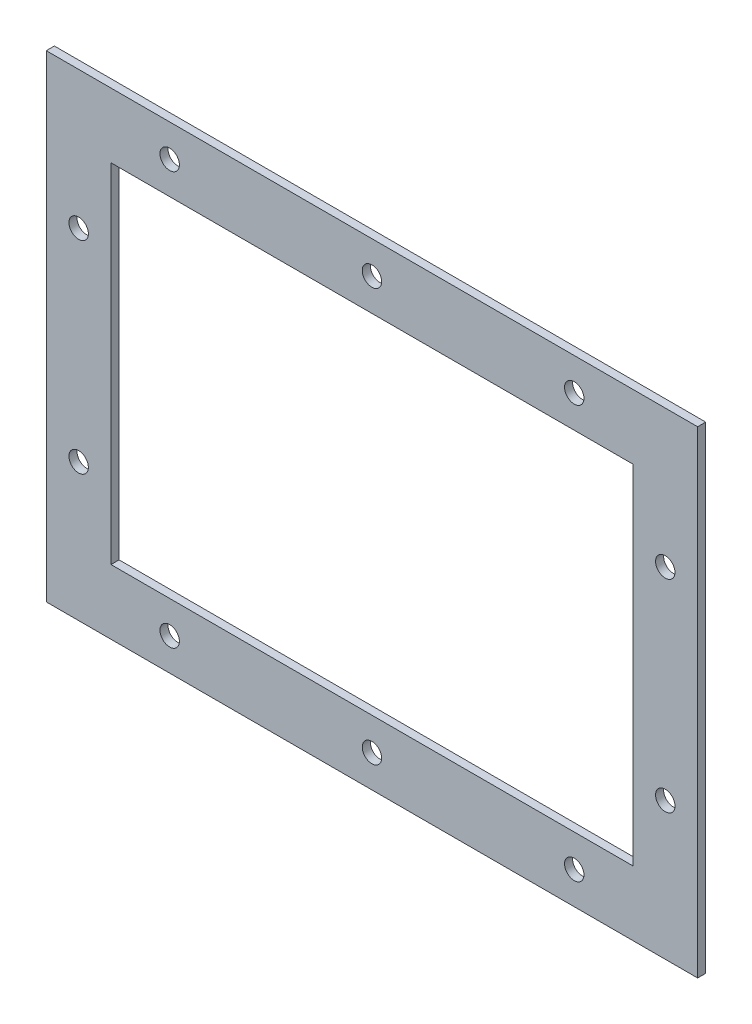
ISO-10303-21;
HEADER;
FILE_DESCRIPTION(('STEP AP214'),'2;1');
FILE_NAME('part.step','',(''),(''),'','','');
FILE_SCHEMA(('AUTOMOTIVE_DESIGN { 1 0 10303 214 1 1 1 1 }'));
ENDSEC;
DATA;
#1=APPLICATION_CONTEXT('core data for automotive mechanical design processes');
#2=APPLICATION_PROTOCOL_DEFINITION('international standard','automotive_design',2000,#1);
#3=PRODUCT_CONTEXT('',#1,'mechanical');
#4=PRODUCT('Part','Part','',(#3));
#5=PRODUCT_RELATED_PRODUCT_CATEGORY('part','',(#4));
#6=PRODUCT_DEFINITION_FORMATION('','',#4);
#7=PRODUCT_DEFINITION_CONTEXT('part definition',#1,'design');
#8=PRODUCT_DEFINITION('design','',#6,#7);
#9=PRODUCT_DEFINITION_SHAPE('','',#8);
#10=(LENGTH_UNIT() NAMED_UNIT(*) SI_UNIT(.MILLI.,.METRE.));
#11=(NAMED_UNIT(*) PLANE_ANGLE_UNIT() SI_UNIT($,.RADIAN.));
#12=(NAMED_UNIT(*) SI_UNIT($,.STERADIAN.) SOLID_ANGLE_UNIT());
#13=UNCERTAINTY_MEASURE_WITH_UNIT(LENGTH_MEASURE(1.E-05),#10,'distance_accuracy_value','');
#14=(GEOMETRIC_REPRESENTATION_CONTEXT(3) GLOBAL_UNCERTAINTY_ASSIGNED_CONTEXT((#13)) GLOBAL_UNIT_ASSIGNED_CONTEXT((#10,
#11,#12)) REPRESENTATION_CONTEXT('',''));
#15=CARTESIAN_POINT('',(0.,0.,0.));
#16=DIRECTION('',(0.,0.,1.));
#17=DIRECTION('',(1.,0.,0.));
#18=AXIS2_PLACEMENT_3D('',#15,#16,#17);
#19=CARTESIAN_POINT('',(0.,0.,5.));
#20=DIRECTION('',(0.,0.,1.));
#21=DIRECTION('',(1.,0.,0.));
#22=AXIS2_PLACEMENT_3D('',#19,#20,#21);
#23=PLANE('',#22);
#24=CARTESIAN_POINT('',(148.780112044818,-55.5000000000001,5.));
#25=DIRECTION('',(0.,0.,1.));
#26=DIRECTION('',(-1.,0.,0.));
#27=AXIS2_PLACEMENT_3D('',#24,#25,#26);
#28=CIRCLE('',#27,6.00000000000002);
#29=CARTESIAN_POINT('',(142.780112044818,-55.5000000000001,5.));
#30=VERTEX_POINT('',#29);
#31=EDGE_CURVE('E266',#30,#30,#28,.T.);
#32=ORIENTED_EDGE('',*,*,#31,.F.);
#33=EDGE_LOOP('',(#32));
#34=FACE_BOUND('',#33,.T.);
#35=CARTESIAN_POINT('',(-157.469887955182,134.5,5.));
#36=DIRECTION('',(0.,0.,1.));
#37=DIRECTION('',(1.,0.,0.));
#38=AXIS2_PLACEMENT_3D('',#35,#36,#37);
#39=CIRCLE('',#38,6.00000000000002);
#40=CARTESIAN_POINT('',(-151.469887955182,134.5,5.));
#41=VERTEX_POINT('',#40);
#42=EDGE_CURVE('E285',#41,#41,#39,.T.);
#43=ORIENTED_EDGE('',*,*,#42,.F.);
#44=EDGE_LOOP('',(#43));
#45=FACE_BOUND('',#44,.T.);
#46=CARTESIAN_POINT('',(92.5301120448178,-120.5,5.));
#47=DIRECTION('',(0.,0.,1.));
#48=DIRECTION('',(-1.,0.,0.));
#49=AXIS2_PLACEMENT_3D('',#46,#47,#48);
#50=CIRCLE('',#49,5.99999999999999);
#51=CARTESIAN_POINT('',(86.5301120448179,-120.5,5.));
#52=VERTEX_POINT('',#51);
#53=EDGE_CURVE('E279',#52,#52,#50,.T.);
#54=ORIENTED_EDGE('',*,*,#53,.F.);
#55=EDGE_LOOP('',(#54));
#56=FACE_BOUND('',#55,.T.);
#57=CARTESIAN_POINT('',(-32.4698879551822,-120.5,5.));
#58=DIRECTION('',(0.,0.,1.));
#59=DIRECTION('',(-1.,0.,0.));
#60=AXIS2_PLACEMENT_3D('',#57,#58,#59);
#61=CIRCLE('',#60,6.00000000000002);
#62=CARTESIAN_POINT('',(-38.4698879551822,-120.5,5.));
#63=VERTEX_POINT('',#62);
#64=EDGE_CURVE('E273',#63,#63,#61,.T.);
#65=ORIENTED_EDGE('',*,*,#64,.F.);
#66=EDGE_LOOP('',(#65));
#67=FACE_BOUND('',#66,.T.);
#68=CARTESIAN_POINT('',(-213.719887955182,-55.5,5.));
#69=DIRECTION('',(0.,0.,1.));
#70=DIRECTION('',(1.,0.,0.));
#71=AXIS2_PLACEMENT_3D('',#68,#69,#70);
#72=CIRCLE('',#71,6.00000000000002);
#73=CARTESIAN_POINT('',(-207.719887955182,-55.5,5.));
#74=VERTEX_POINT('',#73);
#75=EDGE_CURVE('E309',#74,#74,#72,.T.);
#76=ORIENTED_EDGE('',*,*,#75,.F.);
#77=EDGE_LOOP('',(#76));
#78=FACE_BOUND('',#77,.T.);
#79=CARTESIAN_POINT('',(92.5301120448178,134.5,5.));
#80=DIRECTION('',(0.,0.,1.));
#81=DIRECTION('',(1.,0.,0.));
#82=AXIS2_PLACEMENT_3D('',#79,#80,#81);
#83=CIRCLE('',#82,5.99999999999998);
#84=CARTESIAN_POINT('',(98.5301120448178,134.5,5.));
#85=VERTEX_POINT('',#84);
#86=EDGE_CURVE('E296',#85,#85,#83,.T.);
#87=ORIENTED_EDGE('',*,*,#86,.F.);
#88=EDGE_LOOP('',(#87));
#89=FACE_BOUND('',#88,.T.);
#90=CARTESIAN_POINT('',(-32.4698879551822,134.5,5.));
#91=DIRECTION('',(0.,0.,1.));
#92=DIRECTION('',(1.,0.,0.));
#93=AXIS2_PLACEMENT_3D('',#90,#91,#92);
#94=CIRCLE('',#93,6.00000000000002);
#95=CARTESIAN_POINT('',(-26.4698879551821,134.5,5.));
#96=VERTEX_POINT('',#95);
#97=EDGE_CURVE('E297',#96,#96,#94,.T.);
#98=ORIENTED_EDGE('',*,*,#97,.F.);
#99=EDGE_LOOP('',(#98));
#100=FACE_BOUND('',#99,.T.);
#101=CARTESIAN_POINT('',(-157.469887955182,-120.5,5.));
#102=DIRECTION('',(0.,0.,1.));
#103=DIRECTION('',(-1.,0.,0.));
#104=AXIS2_PLACEMENT_3D('',#101,#102,#103);
#105=CIRCLE('',#104,6.00000000000002);
#106=CARTESIAN_POINT('',(-163.469887955182,-120.5,5.));
#107=VERTEX_POINT('',#106);
#108=EDGE_CURVE('E272',#107,#107,#105,.T.);
#109=ORIENTED_EDGE('',*,*,#108,.F.);
#110=EDGE_LOOP('',(#109));
#111=FACE_BOUND('',#110,.T.);
#112=CARTESIAN_POINT('',(148.780112044818,69.4999999999999,5.));
#113=DIRECTION('',(0.,0.,1.));
#114=DIRECTION('',(-1.,0.,0.));
#115=AXIS2_PLACEMENT_3D('',#112,#113,#114);
#116=CIRCLE('',#115,6.00000000000002);
#117=CARTESIAN_POINT('',(142.780112044818,69.4999999999999,5.));
#118=VERTEX_POINT('',#117);
#119=EDGE_CURVE('E263',#118,#118,#116,.T.);
#120=ORIENTED_EDGE('',*,*,#119,.F.);
#121=EDGE_LOOP('',(#120));
#122=FACE_BOUND('',#121,.T.);
#123=CARTESIAN_POINT('',(-213.719887955182,69.5,5.));
#124=DIRECTION('',(0.,0.,1.));
#125=DIRECTION('',(1.,0.,0.));
#126=AXIS2_PLACEMENT_3D('',#123,#124,#125);
#127=CIRCLE('',#126,6.00000000000002);
#128=CARTESIAN_POINT('',(-207.719887955182,69.5,5.));
#129=VERTEX_POINT('',#128);
#130=EDGE_CURVE('E308',#129,#129,#127,.T.);
#131=ORIENTED_EDGE('',*,*,#130,.F.);
#132=EDGE_LOOP('',(#131));
#133=FACE_BOUND('',#132,.T.);
#134=DIRECTION('',(1.,0.,0.));
#135=VECTOR('',#134,1.);
#136=CARTESIAN_POINT('',(-233.719887955182,-140.5,5.));
#137=LINE('',#136,#135);
#138=CARTESIAN_POINT('',(-233.719887955182,-140.5,5.));
#139=VERTEX_POINT('',#138);
#140=CARTESIAN_POINT('',(168.780112044818,-140.5,5.));
#141=VERTEX_POINT('',#140);
#142=EDGE_CURVE('E136',#139,#141,#137,.T.);
#143=ORIENTED_EDGE('',*,*,#142,.T.);
#144=DIRECTION('',(0.,1.,0.));
#145=VECTOR('',#144,1.);
#146=CARTESIAN_POINT('',(168.780112044818,-140.5,5.));
#147=LINE('',#146,#145);
#148=CARTESIAN_POINT('',(168.780112044818,154.5,5.));
#149=VERTEX_POINT('',#148);
#150=EDGE_CURVE('E139',#141,#149,#147,.T.);
#151=ORIENTED_EDGE('',*,*,#150,.T.);
#152=DIRECTION('',(-1.,0.,0.));
#153=VECTOR('',#152,1.);
#154=CARTESIAN_POINT('',(-233.719887955182,154.5,5.));
#155=LINE('',#154,#153);
#156=CARTESIAN_POINT('',(-233.719887955182,154.5,5.));
#157=VERTEX_POINT('',#156);
#158=EDGE_CURVE('E142',#149,#157,#155,.T.);
#159=ORIENTED_EDGE('',*,*,#158,.T.);
#160=DIRECTION('',(0.,-1.,0.));
#161=VECTOR('',#160,1.);
#162=CARTESIAN_POINT('',(-233.719887955182,-140.5,5.));
#163=LINE('',#162,#161);
#164=EDGE_CURVE('E144',#157,#139,#163,.T.);
#165=ORIENTED_EDGE('',*,*,#164,.T.);
#166=EDGE_LOOP('',(#143,#151,#159,#165));
#167=FACE_BOUND('',#166,.T.);
#168=DIRECTION('',(-1.,0.,0.));
#169=VECTOR('',#168,1.);
#170=CARTESIAN_POINT('',(-193.719887955182,114.5,5.));
#171=LINE('',#170,#169);
#172=CARTESIAN_POINT('',(128.780112044818,114.5,5.));
#173=VERTEX_POINT('',#172);
#174=CARTESIAN_POINT('',(-193.719887955182,114.5,5.));
#175=VERTEX_POINT('',#174);
#176=EDGE_CURVE('E106',#173,#175,#171,.T.);
#177=ORIENTED_EDGE('',*,*,#176,.F.);
#178=DIRECTION('',(0.,1.,0.));
#179=VECTOR('',#178,1.);
#180=CARTESIAN_POINT('',(128.780112044818,-100.5,5.));
#181=LINE('',#180,#179);
#182=CARTESIAN_POINT('',(128.780112044818,-100.5,5.));
#183=VERTEX_POINT('',#182);
#184=EDGE_CURVE('E98',#183,#173,#181,.T.);
#185=ORIENTED_EDGE('',*,*,#184,.F.);
#186=DIRECTION('',(1.,0.,0.));
#187=VECTOR('',#186,1.);
#188=CARTESIAN_POINT('',(-193.719887955182,-100.5,5.));
#189=LINE('',#188,#187);
#190=CARTESIAN_POINT('',(-193.719887955182,-100.5,5.));
#191=VERTEX_POINT('',#190);
#192=EDGE_CURVE('E120',#191,#183,#189,.T.);
#193=ORIENTED_EDGE('',*,*,#192,.F.);
#194=DIRECTION('',(0.,-1.,0.));
#195=VECTOR('',#194,1.);
#196=CARTESIAN_POINT('',(-193.719887955182,-100.5,5.));
#197=LINE('',#196,#195);
#198=EDGE_CURVE('E118',#175,#191,#197,.T.);
#199=ORIENTED_EDGE('',*,*,#198,.F.);
#200=EDGE_LOOP('',(#177,#185,#193,#199));
#201=FACE_BOUND('',#200,.T.);
#202=ADVANCED_FACE('F33',(#34,#45,#56,#67,#78,#89,#100,#111,#122,#133,#167,#201),#23,.T.);
#203=CARTESIAN_POINT('',(0.,0.,0.));
#204=DIRECTION('',(0.,0.,1.));
#205=DIRECTION('',(1.,0.,0.));
#206=AXIS2_PLACEMENT_3D('',#203,#204,#205);
#207=PLANE('',#206);
#208=CARTESIAN_POINT('',(148.780112044818,-55.5000000000001,0.));
#209=DIRECTION('',(0.,0.,1.));
#210=DIRECTION('',(-1.,0.,0.));
#211=AXIS2_PLACEMENT_3D('',#208,#209,#210);
#212=CIRCLE('',#211,6.00000000000002);
#213=CARTESIAN_POINT('',(142.780112044818,-55.5000000000001,0.));
#214=VERTEX_POINT('',#213);
#215=EDGE_CURVE('E288',#214,#214,#212,.T.);
#216=ORIENTED_EDGE('',*,*,#215,.T.);
#217=EDGE_LOOP('',(#216));
#218=FACE_BOUND('',#217,.T.);
#219=CARTESIAN_POINT('',(-157.469887955182,134.5,0.));
#220=DIRECTION('',(0.,0.,1.));
#221=DIRECTION('',(1.,0.,0.));
#222=AXIS2_PLACEMENT_3D('',#219,#220,#221);
#223=CIRCLE('',#222,6.00000000000002);
#224=CARTESIAN_POINT('',(-151.469887955182,134.5,0.));
#225=VERTEX_POINT('',#224);
#226=EDGE_CURVE('E282',#225,#225,#223,.T.);
#227=ORIENTED_EDGE('',*,*,#226,.T.);
#228=EDGE_LOOP('',(#227));
#229=FACE_BOUND('',#228,.T.);
#230=CARTESIAN_POINT('',(92.5301120448178,-120.5,0.));
#231=DIRECTION('',(0.,0.,1.));
#232=DIRECTION('',(-1.,0.,0.));
#233=AXIS2_PLACEMENT_3D('',#230,#231,#232);
#234=CIRCLE('',#233,5.99999999999999);
#235=CARTESIAN_POINT('',(86.5301120448179,-120.5,0.));
#236=VERTEX_POINT('',#235);
#237=EDGE_CURVE('E276',#236,#236,#234,.T.);
#238=ORIENTED_EDGE('',*,*,#237,.T.);
#239=EDGE_LOOP('',(#238));
#240=FACE_BOUND('',#239,.T.);
#241=CARTESIAN_POINT('',(-32.4698879551822,-120.5,0.));
#242=DIRECTION('',(0.,0.,1.));
#243=DIRECTION('',(-1.,0.,0.));
#244=AXIS2_PLACEMENT_3D('',#241,#242,#243);
#245=CIRCLE('',#244,6.00000000000002);
#246=CARTESIAN_POINT('',(-38.4698879551822,-120.5,0.));
#247=VERTEX_POINT('',#246);
#248=EDGE_CURVE('E269',#247,#247,#245,.T.);
#249=ORIENTED_EDGE('',*,*,#248,.T.);
#250=EDGE_LOOP('',(#249));
#251=FACE_BOUND('',#250,.T.);
#252=CARTESIAN_POINT('',(-213.719887955182,-55.5,0.));
#253=DIRECTION('',(0.,0.,1.));
#254=DIRECTION('',(1.,0.,0.));
#255=AXIS2_PLACEMENT_3D('',#252,#253,#254);
#256=CIRCLE('',#255,6.00000000000002);
#257=CARTESIAN_POINT('',(-207.719887955182,-55.5,0.));
#258=VERTEX_POINT('',#257);
#259=EDGE_CURVE('E305',#258,#258,#256,.T.);
#260=ORIENTED_EDGE('',*,*,#259,.T.);
#261=EDGE_LOOP('',(#260));
#262=FACE_BOUND('',#261,.T.);
#263=CARTESIAN_POINT('',(92.5301120448178,134.5,0.));
#264=DIRECTION('',(0.,0.,1.));
#265=DIRECTION('',(1.,0.,0.));
#266=AXIS2_PLACEMENT_3D('',#263,#264,#265);
#267=CIRCLE('',#266,5.99999999999998);
#268=CARTESIAN_POINT('',(98.5301120448178,134.5,0.));
#269=VERTEX_POINT('',#268);
#270=EDGE_CURVE('E312',#269,#269,#267,.T.);
#271=ORIENTED_EDGE('',*,*,#270,.T.);
#272=EDGE_LOOP('',(#271));
#273=FACE_BOUND('',#272,.T.);
#274=CARTESIAN_POINT('',(-32.4698879551822,134.5,0.));
#275=DIRECTION('',(0.,0.,1.));
#276=DIRECTION('',(1.,0.,0.));
#277=AXIS2_PLACEMENT_3D('',#274,#275,#276);
#278=CIRCLE('',#277,6.00000000000002);
#279=CARTESIAN_POINT('',(-26.4698879551821,134.5,0.));
#280=VERTEX_POINT('',#279);
#281=EDGE_CURVE('E293',#280,#280,#278,.T.);
#282=ORIENTED_EDGE('',*,*,#281,.T.);
#283=EDGE_LOOP('',(#282));
#284=FACE_BOUND('',#283,.T.);
#285=CARTESIAN_POINT('',(-157.469887955182,-120.5,0.));
#286=DIRECTION('',(0.,0.,1.));
#287=DIRECTION('',(-1.,0.,0.));
#288=AXIS2_PLACEMENT_3D('',#285,#286,#287);
#289=CIRCLE('',#288,6.00000000000002);
#290=CARTESIAN_POINT('',(-163.469887955182,-120.5,0.));
#291=VERTEX_POINT('',#290);
#292=EDGE_CURVE('E300',#291,#291,#289,.T.);
#293=ORIENTED_EDGE('',*,*,#292,.T.);
#294=EDGE_LOOP('',(#293));
#295=FACE_BOUND('',#294,.T.);
#296=CARTESIAN_POINT('',(148.780112044818,69.4999999999999,0.));
#297=DIRECTION('',(0.,0.,1.));
#298=DIRECTION('',(-1.,0.,0.));
#299=AXIS2_PLACEMENT_3D('',#296,#297,#298);
#300=CIRCLE('',#299,6.00000000000002);
#301=CARTESIAN_POINT('',(142.780112044818,69.4999999999999,0.));
#302=VERTEX_POINT('',#301);
#303=EDGE_CURVE('E260',#302,#302,#300,.T.);
#304=ORIENTED_EDGE('',*,*,#303,.T.);
#305=EDGE_LOOP('',(#304));
#306=FACE_BOUND('',#305,.T.);
#307=CARTESIAN_POINT('',(-213.719887955182,69.5,0.));
#308=DIRECTION('',(0.,0.,1.));
#309=DIRECTION('',(1.,0.,0.));
#310=AXIS2_PLACEMENT_3D('',#307,#308,#309);
#311=CIRCLE('',#310,6.00000000000002);
#312=CARTESIAN_POINT('',(-207.719887955182,69.5,0.));
#313=VERTEX_POINT('',#312);
#314=EDGE_CURVE('E126',#313,#313,#311,.T.);
#315=ORIENTED_EDGE('',*,*,#314,.T.);
#316=EDGE_LOOP('',(#315));
#317=FACE_BOUND('',#316,.T.);
#318=DIRECTION('',(1.,0.,0.));
#319=VECTOR('',#318,1.);
#320=CARTESIAN_POINT('',(-233.719887955182,-140.5,0.));
#321=LINE('',#320,#319);
#322=CARTESIAN_POINT('',(-233.719887955182,-140.5,0.));
#323=VERTEX_POINT('',#322);
#324=CARTESIAN_POINT('',(168.780112044818,-140.5,0.));
#325=VERTEX_POINT('',#324);
#326=EDGE_CURVE('E114',#323,#325,#321,.T.);
#327=ORIENTED_EDGE('',*,*,#326,.F.);
#328=DIRECTION('',(0.,-1.,0.));
#329=VECTOR('',#328,1.);
#330=CARTESIAN_POINT('',(-233.719887955182,-140.5,0.));
#331=LINE('',#330,#329);
#332=CARTESIAN_POINT('',(-233.719887955182,154.5,0.));
#333=VERTEX_POINT('',#332);
#334=EDGE_CURVE('E140',#333,#323,#331,.T.);
#335=ORIENTED_EDGE('',*,*,#334,.F.);
#336=DIRECTION('',(-1.,0.,0.));
#337=VECTOR('',#336,1.);
#338=CARTESIAN_POINT('',(-233.719887955182,154.5,0.));
#339=LINE('',#338,#337);
#340=CARTESIAN_POINT('',(168.780112044818,154.5,0.));
#341=VERTEX_POINT('',#340);
#342=EDGE_CURVE('E151',#341,#333,#339,.T.);
#343=ORIENTED_EDGE('',*,*,#342,.F.);
#344=DIRECTION('',(0.,1.,0.));
#345=VECTOR('',#344,1.);
#346=CARTESIAN_POINT('',(168.780112044818,-140.5,0.));
#347=LINE('',#346,#345);
#348=EDGE_CURVE('E149',#325,#341,#347,.T.);
#349=ORIENTED_EDGE('',*,*,#348,.F.);
#350=EDGE_LOOP('',(#327,#335,#343,#349));
#351=FACE_BOUND('',#350,.T.);
#352=DIRECTION('',(0.,1.,0.));
#353=VECTOR('',#352,1.);
#354=CARTESIAN_POINT('',(128.780112044818,-100.5,0.));
#355=LINE('',#354,#353);
#356=CARTESIAN_POINT('',(128.780112044818,-100.5,0.));
#357=VERTEX_POINT('',#356);
#358=CARTESIAN_POINT('',(128.780112044818,114.5,0.));
#359=VERTEX_POINT('',#358);
#360=EDGE_CURVE('E56',#357,#359,#355,.T.);
#361=ORIENTED_EDGE('',*,*,#360,.T.);
#362=DIRECTION('',(-1.,0.,0.));
#363=VECTOR('',#362,1.);
#364=CARTESIAN_POINT('',(-193.719887955182,114.5,0.));
#365=LINE('',#364,#363);
#366=CARTESIAN_POINT('',(-193.719887955182,114.5,0.));
#367=VERTEX_POINT('',#366);
#368=EDGE_CURVE('E113',#359,#367,#365,.T.);
#369=ORIENTED_EDGE('',*,*,#368,.T.);
#370=DIRECTION('',(0.,-1.,0.));
#371=VECTOR('',#370,1.);
#372=CARTESIAN_POINT('',(-193.719887955182,-100.5,0.));
#373=LINE('',#372,#371);
#374=CARTESIAN_POINT('',(-193.719887955182,-100.5,0.));
#375=VERTEX_POINT('',#374);
#376=EDGE_CURVE('E128',#367,#375,#373,.T.);
#377=ORIENTED_EDGE('',*,*,#376,.T.);
#378=DIRECTION('',(1.,0.,0.));
#379=VECTOR('',#378,1.);
#380=CARTESIAN_POINT('',(-193.719887955182,-100.5,0.));
#381=LINE('',#380,#379);
#382=EDGE_CURVE('E107',#375,#357,#381,.T.);
#383=ORIENTED_EDGE('',*,*,#382,.T.);
#384=EDGE_LOOP('',(#361,#369,#377,#383));
#385=FACE_BOUND('',#384,.T.);
#386=ADVANCED_FACE('F169',(#218,#229,#240,#251,#262,#273,#284,#295,#306,#317,#351,#385),#207,.F.);
#387=CARTESIAN_POINT('',(-233.719887955182,-140.5,5.));
#388=DIRECTION('',(0.,1.,0.));
#389=DIRECTION('',(0.,0.,1.));
#390=AXIS2_PLACEMENT_3D('',#387,#388,#389);
#391=PLANE('',#390);
#392=ORIENTED_EDGE('',*,*,#326,.T.);
#393=DIRECTION('',(0.,0.,-1.));
#394=VECTOR('',#393,1.);
#395=CARTESIAN_POINT('',(168.780112044818,-140.5,5.));
#396=LINE('',#395,#394);
#397=EDGE_CURVE('E11',#141,#325,#396,.T.);
#398=ORIENTED_EDGE('',*,*,#397,.F.);
#399=ORIENTED_EDGE('',*,*,#142,.F.);
#400=DIRECTION('',(0.,0.,-1.));
#401=VECTOR('',#400,1.);
#402=CARTESIAN_POINT('',(-233.719887955182,-140.5,5.));
#403=LINE('',#402,#401);
#404=EDGE_CURVE('E146',#139,#323,#403,.T.);
#405=ORIENTED_EDGE('',*,*,#404,.T.);
#406=EDGE_LOOP('',(#392,#398,#399,#405));
#407=FACE_BOUND('',#406,.T.);
#408=ADVANCED_FACE('F35',(#407),#391,.F.);
#409=CARTESIAN_POINT('',(168.780112044818,-140.5,5.));
#410=DIRECTION('',(-1.,0.,0.));
#411=DIRECTION('',(0.,0.,1.));
#412=AXIS2_PLACEMENT_3D('',#409,#410,#411);
#413=PLANE('',#412);
#414=ORIENTED_EDGE('',*,*,#348,.T.);
#415=DIRECTION('',(0.,0.,-1.));
#416=VECTOR('',#415,1.);
#417=CARTESIAN_POINT('',(168.780112044818,154.5,5.));
#418=LINE('',#417,#416);
#419=EDGE_CURVE('E41',#149,#341,#418,.T.);
#420=ORIENTED_EDGE('',*,*,#419,.F.);
#421=ORIENTED_EDGE('',*,*,#150,.F.);
#422=ORIENTED_EDGE('',*,*,#397,.T.);
#423=EDGE_LOOP('',(#414,#420,#421,#422));
#424=FACE_BOUND('',#423,.T.);
#425=ADVANCED_FACE('F179',(#424),#413,.F.);
#426=CARTESIAN_POINT('',(-233.719887955182,154.5,5.));
#427=DIRECTION('',(0.,-1.,0.));
#428=DIRECTION('',(1.,0.,0.));
#429=AXIS2_PLACEMENT_3D('',#426,#427,#428);
#430=PLANE('',#429);
#431=ORIENTED_EDGE('',*,*,#342,.T.);
#432=DIRECTION('',(0.,0.,-1.));
#433=VECTOR('',#432,1.);
#434=CARTESIAN_POINT('',(-233.719887955182,154.5,5.));
#435=LINE('',#434,#433);
#436=EDGE_CURVE('E156',#157,#333,#435,.T.);
#437=ORIENTED_EDGE('',*,*,#436,.F.);
#438=ORIENTED_EDGE('',*,*,#158,.F.);
#439=ORIENTED_EDGE('',*,*,#419,.T.);
#440=EDGE_LOOP('',(#431,#437,#438,#439));
#441=FACE_BOUND('',#440,.T.);
#442=ADVANCED_FACE('F163',(#441),#430,.F.);
#443=CARTESIAN_POINT('',(-233.719887955182,-140.5,5.));
#444=DIRECTION('',(1.,0.,0.));
#445=DIRECTION('',(0.,0.,-1.));
#446=AXIS2_PLACEMENT_3D('',#443,#444,#445);
#447=PLANE('',#446);
#448=ORIENTED_EDGE('',*,*,#334,.T.);
#449=ORIENTED_EDGE('',*,*,#404,.F.);
#450=ORIENTED_EDGE('',*,*,#164,.F.);
#451=ORIENTED_EDGE('',*,*,#436,.T.);
#452=EDGE_LOOP('',(#448,#449,#450,#451));
#453=FACE_BOUND('',#452,.T.);
#454=ADVANCED_FACE('F173',(#453),#447,.F.);
#455=CARTESIAN_POINT('',(128.780112044818,-100.5,5.));
#456=DIRECTION('',(-1.,0.,0.));
#457=DIRECTION('',(0.,0.,1.));
#458=AXIS2_PLACEMENT_3D('',#455,#456,#457);
#459=PLANE('',#458);
#460=ORIENTED_EDGE('',*,*,#360,.F.);
#461=DIRECTION('',(0.,0.,-1.));
#462=VECTOR('',#461,1.);
#463=CARTESIAN_POINT('',(128.780112044818,-100.5,5.));
#464=LINE('',#463,#462);
#465=EDGE_CURVE('E102',#183,#357,#464,.T.);
#466=ORIENTED_EDGE('',*,*,#465,.F.);
#467=ORIENTED_EDGE('',*,*,#184,.T.);
#468=DIRECTION('',(0.,0.,-1.));
#469=VECTOR('',#468,1.);
#470=CARTESIAN_POINT('',(128.780112044818,114.5,5.));
#471=LINE('',#470,#469);
#472=EDGE_CURVE('E101',#173,#359,#471,.T.);
#473=ORIENTED_EDGE('',*,*,#472,.T.);
#474=EDGE_LOOP('',(#460,#466,#467,#473));
#475=FACE_BOUND('',#474,.T.);
#476=ADVANCED_FACE('F100',(#475),#459,.T.);
#477=CARTESIAN_POINT('',(-193.719887955182,114.5,5.));
#478=DIRECTION('',(0.,-1.,0.));
#479=DIRECTION('',(0.,0.,-1.));
#480=AXIS2_PLACEMENT_3D('',#477,#478,#479);
#481=PLANE('',#480);
#482=ORIENTED_EDGE('',*,*,#368,.F.);
#483=ORIENTED_EDGE('',*,*,#472,.F.);
#484=ORIENTED_EDGE('',*,*,#176,.T.);
#485=DIRECTION('',(0.,0.,-1.));
#486=VECTOR('',#485,1.);
#487=CARTESIAN_POINT('',(-193.719887955182,114.5,5.));
#488=LINE('',#487,#486);
#489=EDGE_CURVE('E115',#175,#367,#488,.T.);
#490=ORIENTED_EDGE('',*,*,#489,.T.);
#491=EDGE_LOOP('',(#482,#483,#484,#490));
#492=FACE_BOUND('',#491,.T.);
#493=ADVANCED_FACE('F110',(#492),#481,.T.);
#494=CARTESIAN_POINT('',(-193.719887955182,-100.5,5.));
#495=DIRECTION('',(1.,0.,0.));
#496=DIRECTION('',(0.,0.,-1.));
#497=AXIS2_PLACEMENT_3D('',#494,#495,#496);
#498=PLANE('',#497);
#499=ORIENTED_EDGE('',*,*,#376,.F.);
#500=ORIENTED_EDGE('',*,*,#489,.F.);
#501=ORIENTED_EDGE('',*,*,#198,.T.);
#502=DIRECTION('',(0.,0.,-1.));
#503=VECTOR('',#502,1.);
#504=CARTESIAN_POINT('',(-193.719887955182,-100.5,5.));
#505=LINE('',#504,#503);
#506=EDGE_CURVE('E48',#191,#375,#505,.T.);
#507=ORIENTED_EDGE('',*,*,#506,.T.);
#508=EDGE_LOOP('',(#499,#500,#501,#507));
#509=FACE_BOUND('',#508,.T.);
#510=ADVANCED_FACE('F206',(#509),#498,.T.);
#511=CARTESIAN_POINT('',(-193.719887955182,-100.5,5.));
#512=DIRECTION('',(0.,1.,0.));
#513=DIRECTION('',(0.,0.,1.));
#514=AXIS2_PLACEMENT_3D('',#511,#512,#513);
#515=PLANE('',#514);
#516=ORIENTED_EDGE('',*,*,#382,.F.);
#517=ORIENTED_EDGE('',*,*,#506,.F.);
#518=ORIENTED_EDGE('',*,*,#192,.T.);
#519=ORIENTED_EDGE('',*,*,#465,.T.);
#520=EDGE_LOOP('',(#516,#517,#518,#519));
#521=FACE_BOUND('',#520,.T.);
#522=ADVANCED_FACE('F210',(#521),#515,.T.);
#523=CARTESIAN_POINT('',(-213.719887955182,69.5,0.));
#524=DIRECTION('',(0.,0.,1.));
#525=DIRECTION('',(1.,0.,0.));
#526=AXIS2_PLACEMENT_3D('',#523,#524,#525);
#527=CYLINDRICAL_SURFACE('',#526,6.00000000000002);
#528=ORIENTED_EDGE('',*,*,#314,.F.);
#529=EDGE_LOOP('',(#528));
#530=FACE_BOUND('',#529,.T.);
#531=ORIENTED_EDGE('',*,*,#130,.T.);
#532=EDGE_LOOP('',(#531));
#533=FACE_BOUND('',#532,.T.);
#534=ADVANCED_FACE('F216',(#530,#533),#527,.F.);
#535=CARTESIAN_POINT('',(148.780112044818,69.4999999999999,0.));
#536=DIRECTION('',(0.,0.,1.));
#537=DIRECTION('',(1.,0.,0.));
#538=AXIS2_PLACEMENT_3D('',#535,#536,#537);
#539=CYLINDRICAL_SURFACE('',#538,6.00000000000002);
#540=ORIENTED_EDGE('',*,*,#303,.F.);
#541=EDGE_LOOP('',(#540));
#542=FACE_BOUND('',#541,.T.);
#543=ORIENTED_EDGE('',*,*,#119,.T.);
#544=EDGE_LOOP('',(#543));
#545=FACE_BOUND('',#544,.T.);
#546=ADVANCED_FACE('F219',(#542,#545),#539,.F.);
#547=CARTESIAN_POINT('',(-157.469887955182,-120.5,0.));
#548=DIRECTION('',(0.,0.,1.));
#549=DIRECTION('',(1.,0.,0.));
#550=AXIS2_PLACEMENT_3D('',#547,#548,#549);
#551=CYLINDRICAL_SURFACE('',#550,6.00000000000002);
#552=ORIENTED_EDGE('',*,*,#292,.F.);
#553=EDGE_LOOP('',(#552));
#554=FACE_BOUND('',#553,.T.);
#555=ORIENTED_EDGE('',*,*,#108,.T.);
#556=EDGE_LOOP('',(#555));
#557=FACE_BOUND('',#556,.T.);
#558=ADVANCED_FACE('F231',(#554,#557),#551,.F.);
#559=CARTESIAN_POINT('',(-32.4698879551822,134.5,0.));
#560=DIRECTION('',(0.,0.,1.));
#561=DIRECTION('',(1.,0.,0.));
#562=AXIS2_PLACEMENT_3D('',#559,#560,#561);
#563=CYLINDRICAL_SURFACE('',#562,6.00000000000002);
#564=ORIENTED_EDGE('',*,*,#281,.F.);
#565=EDGE_LOOP('',(#564));
#566=FACE_BOUND('',#565,.T.);
#567=ORIENTED_EDGE('',*,*,#97,.T.);
#568=EDGE_LOOP('',(#567));
#569=FACE_BOUND('',#568,.T.);
#570=ADVANCED_FACE('F225',(#566,#569),#563,.F.);
#571=CARTESIAN_POINT('',(92.5301120448178,134.5,0.));
#572=DIRECTION('',(0.,0.,1.));
#573=DIRECTION('',(1.,0.,0.));
#574=AXIS2_PLACEMENT_3D('',#571,#572,#573);
#575=CYLINDRICAL_SURFACE('',#574,5.99999999999998);
#576=ORIENTED_EDGE('',*,*,#270,.F.);
#577=EDGE_LOOP('',(#576));
#578=FACE_BOUND('',#577,.T.);
#579=ORIENTED_EDGE('',*,*,#86,.T.);
#580=EDGE_LOOP('',(#579));
#581=FACE_BOUND('',#580,.T.);
#582=ADVANCED_FACE('F221',(#578,#581),#575,.F.);
#583=CARTESIAN_POINT('',(-213.719887955182,-55.5,0.));
#584=DIRECTION('',(0.,0.,1.));
#585=DIRECTION('',(1.,0.,0.));
#586=AXIS2_PLACEMENT_3D('',#583,#584,#585);
#587=CYLINDRICAL_SURFACE('',#586,6.00000000000002);
#588=ORIENTED_EDGE('',*,*,#259,.F.);
#589=EDGE_LOOP('',(#588));
#590=FACE_BOUND('',#589,.T.);
#591=ORIENTED_EDGE('',*,*,#75,.T.);
#592=EDGE_LOOP('',(#591));
#593=FACE_BOUND('',#592,.T.);
#594=ADVANCED_FACE('F224',(#590,#593),#587,.F.);
#595=CARTESIAN_POINT('',(-32.4698879551822,-120.5,0.));
#596=DIRECTION('',(0.,0.,1.));
#597=DIRECTION('',(1.,0.,0.));
#598=AXIS2_PLACEMENT_3D('',#595,#596,#597);
#599=CYLINDRICAL_SURFACE('',#598,6.00000000000002);
#600=ORIENTED_EDGE('',*,*,#248,.F.);
#601=EDGE_LOOP('',(#600));
#602=FACE_BOUND('',#601,.T.);
#603=ORIENTED_EDGE('',*,*,#64,.T.);
#604=EDGE_LOOP('',(#603));
#605=FACE_BOUND('',#604,.T.);
#606=ADVANCED_FACE('F229',(#602,#605),#599,.F.);
#607=CARTESIAN_POINT('',(92.5301120448178,-120.5,0.));
#608=DIRECTION('',(0.,0.,1.));
#609=DIRECTION('',(1.,0.,0.));
#610=AXIS2_PLACEMENT_3D('',#607,#608,#609);
#611=CYLINDRICAL_SURFACE('',#610,5.99999999999999);
#612=ORIENTED_EDGE('',*,*,#237,.F.);
#613=EDGE_LOOP('',(#612));
#614=FACE_BOUND('',#613,.T.);
#615=ORIENTED_EDGE('',*,*,#53,.T.);
#616=EDGE_LOOP('',(#615));
#617=FACE_BOUND('',#616,.T.);
#618=ADVANCED_FACE('F245',(#614,#617),#611,.F.);
#619=CARTESIAN_POINT('',(-157.469887955182,134.5,0.));
#620=DIRECTION('',(0.,0.,1.));
#621=DIRECTION('',(1.,0.,0.));
#622=AXIS2_PLACEMENT_3D('',#619,#620,#621);
#623=CYLINDRICAL_SURFACE('',#622,6.00000000000002);
#624=ORIENTED_EDGE('',*,*,#226,.F.);
#625=EDGE_LOOP('',(#624));
#626=FACE_BOUND('',#625,.T.);
#627=ORIENTED_EDGE('',*,*,#42,.T.);
#628=EDGE_LOOP('',(#627));
#629=FACE_BOUND('',#628,.T.);
#630=ADVANCED_FACE('F241',(#626,#629),#623,.F.);
#631=CARTESIAN_POINT('',(148.780112044818,-55.5000000000001,0.));
#632=DIRECTION('',(0.,0.,1.));
#633=DIRECTION('',(1.,0.,0.));
#634=AXIS2_PLACEMENT_3D('',#631,#632,#633);
#635=CYLINDRICAL_SURFACE('',#634,6.00000000000002);
#636=ORIENTED_EDGE('',*,*,#215,.F.);
#637=EDGE_LOOP('',(#636));
#638=FACE_BOUND('',#637,.T.);
#639=ORIENTED_EDGE('',*,*,#31,.T.);
#640=EDGE_LOOP('',(#639));
#641=FACE_BOUND('',#640,.T.);
#642=ADVANCED_FACE('F238',(#638,#641),#635,.F.);
#643=CLOSED_SHELL('',(#202,#386,#408,#425,#442,#454,#476,#493,#510,#522,#534,#546,#558,#570,
#582,#594,#606,#618,#630,#642));
#644=MANIFOLD_SOLID_BREP('B2',#643);
#645=ADVANCED_BREP_SHAPE_REPRESENTATION('',(#18,#644),#14);
#646=SHAPE_DEFINITION_REPRESENTATION(#9,#645);
ENDSEC;
END-ISO-10303-21;
